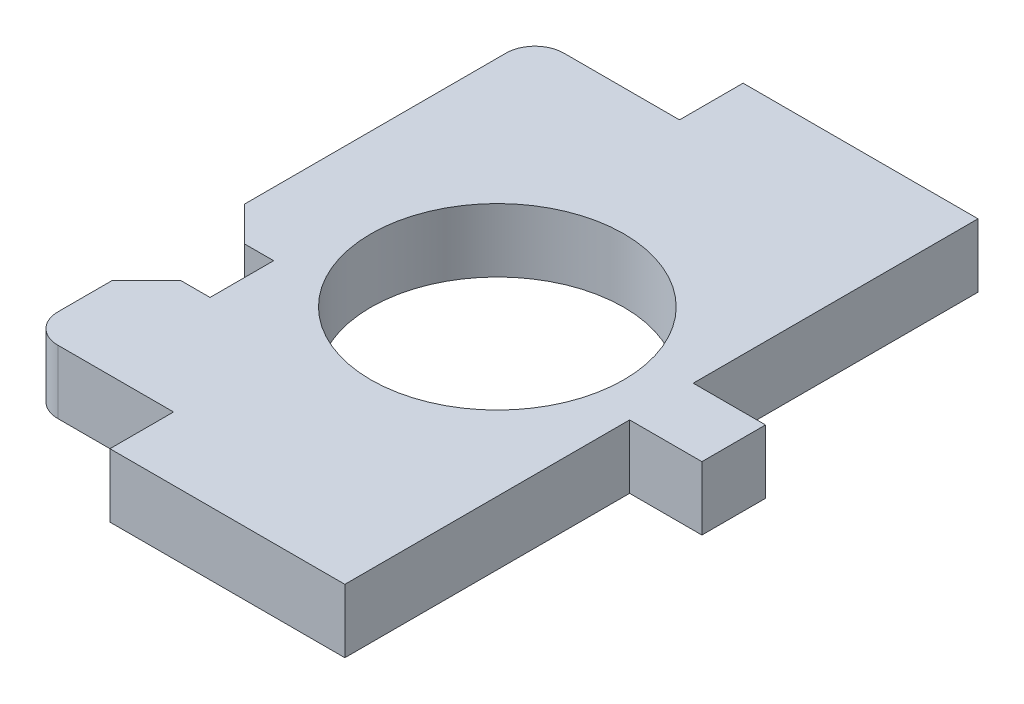
ISO-10303-21;
HEADER;
FILE_DESCRIPTION(('STEP AP214'),'2;1');
FILE_NAME('part.step','',(''),(''),'','','');
FILE_SCHEMA(('AUTOMOTIVE_DESIGN { 1 0 10303 214 1 1 1 1 }'));
ENDSEC;
DATA;
#1=APPLICATION_CONTEXT('core data for automotive mechanical design processes');
#2=APPLICATION_PROTOCOL_DEFINITION('international standard','automotive_design',2000,#1);
#3=PRODUCT_CONTEXT('',#1,'mechanical');
#4=PRODUCT('Part','Part','',(#3));
#5=PRODUCT_RELATED_PRODUCT_CATEGORY('part','',(#4));
#6=PRODUCT_DEFINITION_FORMATION('','',#4);
#7=PRODUCT_DEFINITION_CONTEXT('part definition',#1,'design');
#8=PRODUCT_DEFINITION('design','',#6,#7);
#9=PRODUCT_DEFINITION_SHAPE('','',#8);
#10=(LENGTH_UNIT() NAMED_UNIT(*) SI_UNIT(.MILLI.,.METRE.));
#11=(NAMED_UNIT(*) PLANE_ANGLE_UNIT() SI_UNIT($,.RADIAN.));
#12=(NAMED_UNIT(*) SI_UNIT($,.STERADIAN.) SOLID_ANGLE_UNIT());
#13=UNCERTAINTY_MEASURE_WITH_UNIT(LENGTH_MEASURE(1.E-05),#10,'distance_accuracy_value','');
#14=(GEOMETRIC_REPRESENTATION_CONTEXT(3) GLOBAL_UNCERTAINTY_ASSIGNED_CONTEXT((#13)) GLOBAL_UNIT_ASSIGNED_CONTEXT((#10,
#11,#12)) REPRESENTATION_CONTEXT('',''));
#15=CARTESIAN_POINT('',(0.,0.,0.));
#16=DIRECTION('',(0.,0.,1.));
#17=DIRECTION('',(1.,0.,0.));
#18=AXIS2_PLACEMENT_3D('',#15,#16,#17);
#19=CARTESIAN_POINT('',(13.81125,2.794,22.225));
#20=DIRECTION('',(-1.,0.,0.));
#21=DIRECTION('',(0.,0.,1.));
#22=AXIS2_PLACEMENT_3D('',#19,#20,#21);
#23=PLANE('',#22);
#24=DIRECTION('',(0.,-1.,0.));
#25=VECTOR('',#24,1.);
#26=CARTESIAN_POINT('',(13.81125,2.794,2.79399999999999));
#27=LINE('',#26,#25);
#28=CARTESIAN_POINT('',(13.81125,2.794,2.79399999999999));
#29=VERTEX_POINT('',#28);
#30=CARTESIAN_POINT('',(13.81125,-2.794,2.79399999999999));
#31=VERTEX_POINT('',#30);
#32=EDGE_CURVE('E173',#29,#31,#27,.T.);
#33=ORIENTED_EDGE('',*,*,#32,.F.);
#34=DIRECTION('',(0.,0.,-1.));
#35=VECTOR('',#34,1.);
#36=CARTESIAN_POINT('',(13.81125,2.794,-22.225));
#37=LINE('',#36,#35);
#38=CARTESIAN_POINT('',(13.81125,2.794,27.813));
#39=VERTEX_POINT('',#38);
#40=EDGE_CURVE('E184',#39,#29,#37,.T.);
#41=ORIENTED_EDGE('',*,*,#40,.F.);
#42=DIRECTION('',(0.,-1.,0.));
#43=VECTOR('',#42,1.);
#44=CARTESIAN_POINT('',(13.81125,2.794,27.813));
#45=LINE('',#44,#43);
#46=CARTESIAN_POINT('',(13.81125,-2.794,27.813));
#47=VERTEX_POINT('',#46);
#48=EDGE_CURVE('E234',#39,#47,#45,.T.);
#49=ORIENTED_EDGE('',*,*,#48,.T.);
#50=DIRECTION('',(0.,0.,-1.));
#51=VECTOR('',#50,1.);
#52=CARTESIAN_POINT('',(13.81125,-2.794,22.225));
#53=LINE('',#52,#51);
#54=EDGE_CURVE('E186',#47,#31,#53,.T.);
#55=ORIENTED_EDGE('',*,*,#54,.T.);
#56=EDGE_LOOP('',(#33,#41,#49,#55));
#57=FACE_BOUND('',#56,.T.);
#58=ADVANCED_FACE('F33',(#57),#23,.F.);
#59=CARTESIAN_POINT('',(-6.82625,2.794,-27.813));
#60=DIRECTION('',(0.,0.,1.));
#61=DIRECTION('',(1.,0.,0.));
#62=AXIS2_PLACEMENT_3D('',#59,#60,#61);
#63=PLANE('',#62);
#64=DIRECTION('',(-1.,0.,0.));
#65=VECTOR('',#64,1.);
#66=CARTESIAN_POINT('',(-6.82625,-2.794,-27.813));
#67=LINE('',#66,#65);
#68=CARTESIAN_POINT('',(13.81125,-2.794,-27.813));
#69=VERTEX_POINT('',#68);
#70=CARTESIAN_POINT('',(-6.82625,-2.794,-27.813));
#71=VERTEX_POINT('',#70);
#72=EDGE_CURVE('E187',#69,#71,#67,.T.);
#73=ORIENTED_EDGE('',*,*,#72,.T.);
#74=DIRECTION('',(0.,-1.,0.));
#75=VECTOR('',#74,1.);
#76=CARTESIAN_POINT('',(-6.82625,2.794,-27.813));
#77=LINE('',#76,#75);
#78=CARTESIAN_POINT('',(-6.82625,2.794,-27.813));
#79=VERTEX_POINT('',#78);
#80=EDGE_CURVE('E271',#79,#71,#77,.T.);
#81=ORIENTED_EDGE('',*,*,#80,.F.);
#82=DIRECTION('',(-1.,0.,0.));
#83=VECTOR('',#82,1.);
#84=CARTESIAN_POINT('',(-6.82625,2.794,-27.813));
#85=LINE('',#84,#83);
#86=CARTESIAN_POINT('',(13.81125,2.794,-27.813));
#87=VERTEX_POINT('',#86);
#88=EDGE_CURVE('E194',#87,#79,#85,.T.);
#89=ORIENTED_EDGE('',*,*,#88,.F.);
#90=DIRECTION('',(0.,-1.,0.));
#91=VECTOR('',#90,1.);
#92=CARTESIAN_POINT('',(13.81125,2.794,-27.813));
#93=LINE('',#92,#91);
#94=EDGE_CURVE('E267',#87,#69,#93,.T.);
#95=ORIENTED_EDGE('',*,*,#94,.T.);
#96=EDGE_LOOP('',(#73,#81,#89,#95));
#97=FACE_BOUND('',#96,.T.);
#98=ADVANCED_FACE('F350',(#97),#63,.F.);
#99=CARTESIAN_POINT('',(-6.82625,2.794,-22.225));
#100=DIRECTION('',(1.,0.,0.));
#101=DIRECTION('',(0.,0.,-1.));
#102=AXIS2_PLACEMENT_3D('',#99,#100,#101);
#103=PLANE('',#102);
#104=DIRECTION('',(0.,0.,1.));
#105=VECTOR('',#104,1.);
#106=CARTESIAN_POINT('',(-6.82625,-2.794,-22.225));
#107=LINE('',#106,#105);
#108=CARTESIAN_POINT('',(-6.82625,-2.794,-22.225));
#109=VERTEX_POINT('',#108);
#110=EDGE_CURVE('E236',#71,#109,#107,.T.);
#111=ORIENTED_EDGE('',*,*,#110,.T.);
#112=DIRECTION('',(0.,-1.,0.));
#113=VECTOR('',#112,1.);
#114=CARTESIAN_POINT('',(-6.82625,2.794,-22.225));
#115=LINE('',#114,#113);
#116=CARTESIAN_POINT('',(-6.82625,2.794,-22.225));
#117=VERTEX_POINT('',#116);
#118=EDGE_CURVE('E274',#117,#109,#115,.T.);
#119=ORIENTED_EDGE('',*,*,#118,.F.);
#120=DIRECTION('',(0.,0.,1.));
#121=VECTOR('',#120,1.);
#122=CARTESIAN_POINT('',(-6.82625,2.794,-22.225));
#123=LINE('',#122,#121);
#124=EDGE_CURVE('E197',#79,#117,#123,.T.);
#125=ORIENTED_EDGE('',*,*,#124,.F.);
#126=ORIENTED_EDGE('',*,*,#80,.T.);
#127=EDGE_LOOP('',(#111,#119,#125,#126));
#128=FACE_BOUND('',#127,.T.);
#129=ADVANCED_FACE('F356',(#128),#103,.F.);
#130=CARTESIAN_POINT('',(-13.81125,2.794,-22.225));
#131=DIRECTION('',(0.,0.,1.));
#132=DIRECTION('',(1.,0.,0.));
#133=AXIS2_PLACEMENT_3D('',#130,#131,#132);
#134=PLANE('',#133);
#135=DIRECTION('',(-1.,0.,0.));
#136=VECTOR('',#135,1.);
#137=CARTESIAN_POINT('',(-13.81125,-2.794,-22.225));
#138=LINE('',#137,#136);
#139=CARTESIAN_POINT('',(-16.98625,-2.794,-22.225));
#140=VERTEX_POINT('',#139);
#141=EDGE_CURVE('E239',#109,#140,#138,.T.);
#142=ORIENTED_EDGE('',*,*,#141,.T.);
#143=DIRECTION('',(0.,-1.,0.));
#144=VECTOR('',#143,1.);
#145=CARTESIAN_POINT('',(-16.98625,2.794,-22.225));
#146=LINE('',#145,#144);
#147=CARTESIAN_POINT('',(-16.98625,2.794,-22.225));
#148=VERTEX_POINT('',#147);
#149=EDGE_CURVE('E328',#140,#148,#146,.F.);
#150=ORIENTED_EDGE('',*,*,#149,.T.);
#151=DIRECTION('',(-1.,0.,0.));
#152=VECTOR('',#151,1.);
#153=CARTESIAN_POINT('',(-13.81125,2.794,-22.225));
#154=LINE('',#153,#152);
#155=EDGE_CURVE('E213',#117,#148,#154,.T.);
#156=ORIENTED_EDGE('',*,*,#155,.F.);
#157=ORIENTED_EDGE('',*,*,#118,.T.);
#158=EDGE_LOOP('',(#142,#150,#156,#157));
#159=FACE_BOUND('',#158,.T.);
#160=ADVANCED_FACE('F435',(#159),#134,.F.);
#161=CARTESIAN_POINT('',(-19.52625,2.794,-22.225));
#162=DIRECTION('',(1.,0.,0.));
#163=DIRECTION('',(0.,0.,-1.));
#164=AXIS2_PLACEMENT_3D('',#161,#162,#163);
#165=PLANE('',#164);
#166=DIRECTION('',(0.,0.,1.));
#167=VECTOR('',#166,1.);
#168=CARTESIAN_POINT('',(-19.52625,2.794,-22.225));
#169=LINE('',#168,#167);
#170=CARTESIAN_POINT('',(-19.52625,2.794,-19.685));
#171=VERTEX_POINT('',#170);
#172=CARTESIAN_POINT('',(-19.52625,2.794,3.27025000000001));
#173=VERTEX_POINT('',#172);
#174=EDGE_CURVE('E215',#171,#173,#169,.T.);
#175=ORIENTED_EDGE('',*,*,#174,.F.);
#176=DIRECTION('',(0.,-1.,0.));
#177=VECTOR('',#176,1.);
#178=CARTESIAN_POINT('',(-19.52625,2.794,-19.685));
#179=LINE('',#178,#177);
#180=CARTESIAN_POINT('',(-19.52625,-2.794,-19.685));
#181=VERTEX_POINT('',#180);
#182=EDGE_CURVE('E270',#171,#181,#179,.T.);
#183=ORIENTED_EDGE('',*,*,#182,.T.);
#184=DIRECTION('',(0.,0.,1.));
#185=VECTOR('',#184,1.);
#186=CARTESIAN_POINT('',(-19.52625,-2.794,-22.225));
#187=LINE('',#186,#185);
#188=CARTESIAN_POINT('',(-19.52625,-2.794,3.27025000000001));
#189=VERTEX_POINT('',#188);
#190=EDGE_CURVE('E242',#181,#189,#187,.T.);
#191=ORIENTED_EDGE('',*,*,#190,.T.);
#192=DIRECTION('',(0.,-1.,0.));
#193=VECTOR('',#192,1.);
#194=CARTESIAN_POINT('',(-19.52625,2.794,3.27025000000001));
#195=LINE('',#194,#193);
#196=EDGE_CURVE('E277',#173,#189,#195,.T.);
#197=ORIENTED_EDGE('',*,*,#196,.F.);
#198=EDGE_LOOP('',(#175,#183,#191,#197));
#199=FACE_BOUND('',#198,.T.);
#200=ADVANCED_FACE('F392',(#199),#165,.F.);
#201=CARTESIAN_POINT('',(-19.52625,2.794,3.27025000000001));
#202=DIRECTION('',(0.707106781186546,0.,-0.707106781186549));
#203=DIRECTION('',(-0.707106781186549,0.,-0.707106781186546));
#204=AXIS2_PLACEMENT_3D('',#201,#202,#203);
#205=PLANE('',#204);
#206=DIRECTION('',(0.707106781186549,0.,0.707106781186546));
#207=VECTOR('',#206,1.);
#208=CARTESIAN_POINT('',(-19.52625,-2.794,3.27025000000001));
#209=LINE('',#208,#207);
#210=CARTESIAN_POINT('',(-16.47825,-2.794,6.31825));
#211=VERTEX_POINT('',#210);
#212=EDGE_CURVE('E244',#189,#211,#209,.T.);
#213=ORIENTED_EDGE('',*,*,#212,.T.);
#214=DIRECTION('',(0.,-1.,0.));
#215=VECTOR('',#214,1.);
#216=CARTESIAN_POINT('',(-16.47825,2.794,6.31825));
#217=LINE('',#216,#215);
#218=CARTESIAN_POINT('',(-16.47825,2.794,6.31825));
#219=VERTEX_POINT('',#218);
#220=EDGE_CURVE('E280',#219,#211,#217,.T.);
#221=ORIENTED_EDGE('',*,*,#220,.F.);
#222=DIRECTION('',(0.707106781186549,0.,0.707106781186546));
#223=VECTOR('',#222,1.);
#224=CARTESIAN_POINT('',(-19.52625,2.794,3.27025000000001));
#225=LINE('',#224,#223);
#226=EDGE_CURVE('E217',#173,#219,#225,.T.);
#227=ORIENTED_EDGE('',*,*,#226,.F.);
#228=ORIENTED_EDGE('',*,*,#196,.T.);
#229=EDGE_LOOP('',(#213,#221,#227,#228));
#230=FACE_BOUND('',#229,.T.);
#231=ADVANCED_FACE('F399',(#230),#205,.F.);
#232=CARTESIAN_POINT('',(-16.47825,2.794,6.31825));
#233=DIRECTION('',(0.,0.,-1.));
#234=DIRECTION('',(-1.,0.,0.));
#235=AXIS2_PLACEMENT_3D('',#232,#233,#234);
#236=PLANE('',#235);
#237=DIRECTION('',(1.,0.,0.));
#238=VECTOR('',#237,1.);
#239=CARTESIAN_POINT('',(-16.47825,-2.794,6.31825));
#240=LINE('',#239,#238);
#241=CARTESIAN_POINT('',(-13.93825,-2.794,6.31824999999999));
#242=VERTEX_POINT('',#241);
#243=EDGE_CURVE('E246',#211,#242,#240,.T.);
#244=ORIENTED_EDGE('',*,*,#243,.T.);
#245=DIRECTION('',(0.,-1.,0.));
#246=VECTOR('',#245,1.);
#247=CARTESIAN_POINT('',(-13.93825,2.794,6.31824999999999));
#248=LINE('',#247,#246);
#249=CARTESIAN_POINT('',(-13.93825,2.794,6.31824999999999));
#250=VERTEX_POINT('',#249);
#251=EDGE_CURVE('E283',#250,#242,#248,.T.);
#252=ORIENTED_EDGE('',*,*,#251,.F.);
#253=DIRECTION('',(1.,0.,0.));
#254=VECTOR('',#253,1.);
#255=CARTESIAN_POINT('',(-16.47825,2.794,6.31825));
#256=LINE('',#255,#254);
#257=EDGE_CURVE('E219',#219,#250,#256,.T.);
#258=ORIENTED_EDGE('',*,*,#257,.F.);
#259=ORIENTED_EDGE('',*,*,#220,.T.);
#260=EDGE_LOOP('',(#244,#252,#258,#259));
#261=FACE_BOUND('',#260,.T.);
#262=ADVANCED_FACE('F403',(#261),#236,.F.);
#263=CARTESIAN_POINT('',(-13.93825,2.794,6.31824999999999));
#264=DIRECTION('',(1.,0.,0.));
#265=DIRECTION('',(0.,0.,-1.));
#266=AXIS2_PLACEMENT_3D('',#263,#264,#265);
#267=PLANE('',#266);
#268=DIRECTION('',(0.,0.,1.));
#269=VECTOR('',#268,1.);
#270=CARTESIAN_POINT('',(-13.93825,-2.794,6.31824999999999));
#271=LINE('',#270,#269);
#272=CARTESIAN_POINT('',(-13.93825,-2.794,11.90625));
#273=VERTEX_POINT('',#272);
#274=EDGE_CURVE('E248',#242,#273,#271,.T.);
#275=ORIENTED_EDGE('',*,*,#274,.T.);
#276=DIRECTION('',(0.,-1.,0.));
#277=VECTOR('',#276,1.);
#278=CARTESIAN_POINT('',(-13.93825,2.794,11.90625));
#279=LINE('',#278,#277);
#280=CARTESIAN_POINT('',(-13.93825,2.794,11.90625));
#281=VERTEX_POINT('',#280);
#282=EDGE_CURVE('E286',#281,#273,#279,.T.);
#283=ORIENTED_EDGE('',*,*,#282,.F.);
#284=DIRECTION('',(0.,0.,1.));
#285=VECTOR('',#284,1.);
#286=CARTESIAN_POINT('',(-13.93825,2.794,6.31824999999999));
#287=LINE('',#286,#285);
#288=EDGE_CURVE('E221',#250,#281,#287,.T.);
#289=ORIENTED_EDGE('',*,*,#288,.F.);
#290=ORIENTED_EDGE('',*,*,#251,.T.);
#291=EDGE_LOOP('',(#275,#283,#289,#290));
#292=FACE_BOUND('',#291,.T.);
#293=ADVANCED_FACE('F410',(#292),#267,.F.);
#294=CARTESIAN_POINT('',(-13.93825,2.794,11.90625));
#295=DIRECTION('',(0.,0.,1.));
#296=DIRECTION('',(1.,0.,0.));
#297=AXIS2_PLACEMENT_3D('',#294,#295,#296);
#298=PLANE('',#297);
#299=DIRECTION('',(-1.,0.,0.));
#300=VECTOR('',#299,1.);
#301=CARTESIAN_POINT('',(-13.93825,-2.794,11.90625));
#302=LINE('',#301,#300);
#303=CARTESIAN_POINT('',(-16.47825,-2.794,11.90625));
#304=VERTEX_POINT('',#303);
#305=EDGE_CURVE('E250',#273,#304,#302,.T.);
#306=ORIENTED_EDGE('',*,*,#305,.T.);
#307=DIRECTION('',(0.,-1.,0.));
#308=VECTOR('',#307,1.);
#309=CARTESIAN_POINT('',(-16.47825,2.794,11.90625));
#310=LINE('',#309,#308);
#311=CARTESIAN_POINT('',(-16.47825,2.794,11.90625));
#312=VERTEX_POINT('',#311);
#313=EDGE_CURVE('E289',#312,#304,#310,.T.);
#314=ORIENTED_EDGE('',*,*,#313,.F.);
#315=DIRECTION('',(-1.,0.,0.));
#316=VECTOR('',#315,1.);
#317=CARTESIAN_POINT('',(-13.93825,2.794,11.90625));
#318=LINE('',#317,#316);
#319=EDGE_CURVE('E223',#281,#312,#318,.T.);
#320=ORIENTED_EDGE('',*,*,#319,.F.);
#321=ORIENTED_EDGE('',*,*,#282,.T.);
#322=EDGE_LOOP('',(#306,#314,#320,#321));
#323=FACE_BOUND('',#322,.T.);
#324=ADVANCED_FACE('F413',(#323),#298,.F.);
#325=CARTESIAN_POINT('',(-16.47825,2.794,11.90625));
#326=DIRECTION('',(0.707106781186546,0.,0.707106781186549));
#327=DIRECTION('',(0.707106781186549,0.,-0.707106781186546));
#328=AXIS2_PLACEMENT_3D('',#325,#326,#327);
#329=PLANE('',#328);
#330=DIRECTION('',(-0.707106781186549,0.,0.707106781186546));
#331=VECTOR('',#330,1.);
#332=CARTESIAN_POINT('',(-16.47825,-2.794,11.90625));
#333=LINE('',#332,#331);
#334=CARTESIAN_POINT('',(-19.52625,-2.794,14.95425));
#335=VERTEX_POINT('',#334);
#336=EDGE_CURVE('E252',#304,#335,#333,.T.);
#337=ORIENTED_EDGE('',*,*,#336,.T.);
#338=DIRECTION('',(0.,-1.,0.));
#339=VECTOR('',#338,1.);
#340=CARTESIAN_POINT('',(-19.52625,2.794,14.95425));
#341=LINE('',#340,#339);
#342=CARTESIAN_POINT('',(-19.52625,2.794,14.95425));
#343=VERTEX_POINT('',#342);
#344=EDGE_CURVE('E292',#343,#335,#341,.T.);
#345=ORIENTED_EDGE('',*,*,#344,.F.);
#346=DIRECTION('',(-0.707106781186549,0.,0.707106781186546));
#347=VECTOR('',#346,1.);
#348=CARTESIAN_POINT('',(-16.47825,2.794,11.90625));
#349=LINE('',#348,#347);
#350=EDGE_CURVE('E225',#312,#343,#349,.T.);
#351=ORIENTED_EDGE('',*,*,#350,.F.);
#352=ORIENTED_EDGE('',*,*,#313,.T.);
#353=EDGE_LOOP('',(#337,#345,#351,#352));
#354=FACE_BOUND('',#353,.T.);
#355=ADVANCED_FACE('F416',(#354),#329,.F.);
#356=CARTESIAN_POINT('',(-19.52625,2.794,14.95425));
#357=DIRECTION('',(1.,0.,0.));
#358=DIRECTION('',(0.,0.,-1.));
#359=AXIS2_PLACEMENT_3D('',#356,#357,#358);
#360=PLANE('',#359);
#361=DIRECTION('',(0.,0.,1.));
#362=VECTOR('',#361,1.);
#363=CARTESIAN_POINT('',(-19.52625,-2.794,14.95425));
#364=LINE('',#363,#362);
#365=CARTESIAN_POINT('',(-19.52625,-2.794,19.685));
#366=VERTEX_POINT('',#365);
#367=EDGE_CURVE('E254',#335,#366,#364,.T.);
#368=ORIENTED_EDGE('',*,*,#367,.T.);
#369=DIRECTION('',(0.,-1.,0.));
#370=VECTOR('',#369,1.);
#371=CARTESIAN_POINT('',(-19.52625,2.794,19.685));
#372=LINE('',#371,#370);
#373=CARTESIAN_POINT('',(-19.52625,2.794,19.685));
#374=VERTEX_POINT('',#373);
#375=EDGE_CURVE('E11',#366,#374,#372,.F.);
#376=ORIENTED_EDGE('',*,*,#375,.T.);
#377=DIRECTION('',(0.,0.,1.));
#378=VECTOR('',#377,1.);
#379=CARTESIAN_POINT('',(-19.52625,2.794,14.95425));
#380=LINE('',#379,#378);
#381=EDGE_CURVE('E227',#343,#374,#380,.T.);
#382=ORIENTED_EDGE('',*,*,#381,.F.);
#383=ORIENTED_EDGE('',*,*,#344,.T.);
#384=EDGE_LOOP('',(#368,#376,#382,#383));
#385=FACE_BOUND('',#384,.T.);
#386=ADVANCED_FACE('F340',(#385),#360,.F.);
#387=CARTESIAN_POINT('',(-13.81125,2.794,22.225));
#388=DIRECTION('',(0.,0.,-1.));
#389=DIRECTION('',(-1.,0.,0.));
#390=AXIS2_PLACEMENT_3D('',#387,#388,#389);
#391=PLANE('',#390);
#392=DIRECTION('',(1.,0.,0.));
#393=VECTOR('',#392,1.);
#394=CARTESIAN_POINT('',(-19.52625,2.794,22.225));
#395=LINE('',#394,#393);
#396=CARTESIAN_POINT('',(-16.98625,2.794,22.225));
#397=VERTEX_POINT('',#396);
#398=CARTESIAN_POINT('',(-6.82625,2.794,22.225));
#399=VERTEX_POINT('',#398);
#400=EDGE_CURVE('E229',#397,#399,#395,.T.);
#401=ORIENTED_EDGE('',*,*,#400,.F.);
#402=DIRECTION('',(0.,-1.,0.));
#403=VECTOR('',#402,1.);
#404=CARTESIAN_POINT('',(-16.98625,2.794,22.225));
#405=LINE('',#404,#403);
#406=CARTESIAN_POINT('',(-16.98625,-2.794,22.225));
#407=VERTEX_POINT('',#406);
#408=EDGE_CURVE('E41',#397,#407,#405,.T.);
#409=ORIENTED_EDGE('',*,*,#408,.T.);
#410=DIRECTION('',(1.,0.,0.));
#411=VECTOR('',#410,1.);
#412=CARTESIAN_POINT('',(-13.81125,-2.794,22.225));
#413=LINE('',#412,#411);
#414=CARTESIAN_POINT('',(-6.82625,-2.794,22.225));
#415=VERTEX_POINT('',#414);
#416=EDGE_CURVE('E256',#407,#415,#413,.T.);
#417=ORIENTED_EDGE('',*,*,#416,.T.);
#418=DIRECTION('',(0.,-1.,0.));
#419=VECTOR('',#418,1.);
#420=CARTESIAN_POINT('',(-6.82625,2.794,22.225));
#421=LINE('',#420,#419);
#422=EDGE_CURVE('E295',#399,#415,#421,.T.);
#423=ORIENTED_EDGE('',*,*,#422,.F.);
#424=EDGE_LOOP('',(#401,#409,#417,#423));
#425=FACE_BOUND('',#424,.T.);
#426=ADVANCED_FACE('F335',(#425),#391,.F.);
#427=CARTESIAN_POINT('',(-6.82625,2.794,22.225));
#428=DIRECTION('',(1.,0.,0.));
#429=DIRECTION('',(0.,0.,-1.));
#430=AXIS2_PLACEMENT_3D('',#427,#428,#429);
#431=PLANE('',#430);
#432=DIRECTION('',(0.,0.,1.));
#433=VECTOR('',#432,1.);
#434=CARTESIAN_POINT('',(-6.82625,-2.794,22.225));
#435=LINE('',#434,#433);
#436=CARTESIAN_POINT('',(-6.82625,-2.794,27.813));
#437=VERTEX_POINT('',#436);
#438=EDGE_CURVE('E258',#415,#437,#435,.T.);
#439=ORIENTED_EDGE('',*,*,#438,.T.);
#440=DIRECTION('',(0.,-1.,0.));
#441=VECTOR('',#440,1.);
#442=CARTESIAN_POINT('',(-6.82625,2.794,27.813));
#443=LINE('',#442,#441);
#444=CARTESIAN_POINT('',(-6.82625,2.794,27.813));
#445=VERTEX_POINT('',#444);
#446=EDGE_CURVE('E297',#445,#437,#443,.T.);
#447=ORIENTED_EDGE('',*,*,#446,.F.);
#448=DIRECTION('',(0.,0.,1.));
#449=VECTOR('',#448,1.);
#450=CARTESIAN_POINT('',(-6.82625,2.794,22.225));
#451=LINE('',#450,#449);
#452=EDGE_CURVE('E231',#399,#445,#451,.T.);
#453=ORIENTED_EDGE('',*,*,#452,.F.);
#454=ORIENTED_EDGE('',*,*,#422,.T.);
#455=EDGE_LOOP('',(#439,#447,#453,#454));
#456=FACE_BOUND('',#455,.T.);
#457=ADVANCED_FACE('F369',(#456),#431,.F.);
#458=CARTESIAN_POINT('',(-6.82625,2.794,27.813));
#459=DIRECTION('',(0.,0.,-1.));
#460=DIRECTION('',(-1.,0.,0.));
#461=AXIS2_PLACEMENT_3D('',#458,#459,#460);
#462=PLANE('',#461);
#463=DIRECTION('',(1.,0.,0.));
#464=VECTOR('',#463,1.);
#465=CARTESIAN_POINT('',(-6.82625,-2.794,27.813));
#466=LINE('',#465,#464);
#467=EDGE_CURVE('E260',#437,#47,#466,.T.);
#468=ORIENTED_EDGE('',*,*,#467,.T.);
#469=ORIENTED_EDGE('',*,*,#48,.F.);
#470=DIRECTION('',(1.,0.,0.));
#471=VECTOR('',#470,1.);
#472=CARTESIAN_POINT('',(-6.82625,2.794,27.813));
#473=LINE('',#472,#471);
#474=EDGE_CURVE('E192',#445,#39,#473,.T.);
#475=ORIENTED_EDGE('',*,*,#474,.F.);
#476=ORIENTED_EDGE('',*,*,#446,.T.);
#477=EDGE_LOOP('',(#468,#469,#475,#476));
#478=FACE_BOUND('',#477,.T.);
#479=ADVANCED_FACE('F302',(#478),#462,.F.);
#480=CARTESIAN_POINT('',(13.81125,2.794,-2.79399999999999));
#481=VERTEX_POINT('',#480);
#482=EDGE_CURVE('E195',#481,#87,#37,.T.);
#483=ORIENTED_EDGE('',*,*,#482,.F.);
#484=DIRECTION('',(0.,-1.,0.));
#485=VECTOR('',#484,1.);
#486=CARTESIAN_POINT('',(13.81125,2.794,-2.79399999999999));
#487=LINE('',#486,#485);
#488=CARTESIAN_POINT('',(13.81125,-2.794,-2.79399999999999));
#489=VERTEX_POINT('',#488);
#490=EDGE_CURVE('E374',#481,#489,#487,.T.);
#491=ORIENTED_EDGE('',*,*,#490,.T.);
#492=EDGE_CURVE('E202',#489,#69,#53,.T.);
#493=ORIENTED_EDGE('',*,*,#492,.T.);
#494=ORIENTED_EDGE('',*,*,#94,.F.);
#495=EDGE_LOOP('',(#483,#491,#493,#494));
#496=FACE_BOUND('',#495,.T.);
#497=ADVANCED_FACE('F352',(#496),#23,.F.);
#498=CARTESIAN_POINT('',(0.,2.794,0.));
#499=DIRECTION('',(0.,-1.,0.));
#500=DIRECTION('',(0.,0.,-1.));
#501=AXIS2_PLACEMENT_3D('',#498,#499,#500);
#502=PLANE('',#501);
#503=CARTESIAN_POINT('',(-0.604747552220675,2.794,0.));
#504=DIRECTION('',(0.,1.,0.));
#505=DIRECTION('',(0.,0.,1.));
#506=AXIS2_PLACEMENT_3D('',#503,#504,#505);
#507=CIRCLE('',#506,11.1125);
#508=CARTESIAN_POINT('',(-0.604747552220675,2.794,11.1125));
#509=VERTEX_POINT('',#508);
#510=EDGE_CURVE('E316',#509,#509,#507,.T.);
#511=ORIENTED_EDGE('',*,*,#510,.F.);
#512=EDGE_LOOP('',(#511));
#513=FACE_BOUND('',#512,.T.);
#514=ORIENTED_EDGE('',*,*,#155,.T.);
#515=CARTESIAN_POINT('',(-16.98625,2.794,-19.685));
#516=DIRECTION('',(0.,-1.,0.));
#517=DIRECTION('',(0.,0.,-1.));
#518=AXIS2_PLACEMENT_3D('',#515,#516,#517);
#519=CIRCLE('',#518,2.54);
#520=EDGE_CURVE('E331',#148,#171,#519,.F.);
#521=ORIENTED_EDGE('',*,*,#520,.T.);
#522=ORIENTED_EDGE('',*,*,#174,.T.);
#523=ORIENTED_EDGE('',*,*,#226,.T.);
#524=ORIENTED_EDGE('',*,*,#257,.T.);
#525=ORIENTED_EDGE('',*,*,#288,.T.);
#526=ORIENTED_EDGE('',*,*,#319,.T.);
#527=ORIENTED_EDGE('',*,*,#350,.T.);
#528=ORIENTED_EDGE('',*,*,#381,.T.);
#529=CARTESIAN_POINT('',(-16.98625,2.794,19.685));
#530=DIRECTION('',(0.,-1.,0.));
#531=DIRECTION('',(0.,0.,-1.));
#532=AXIS2_PLACEMENT_3D('',#529,#530,#531);
#533=CIRCLE('',#532,2.54);
#534=EDGE_CURVE('E48',#374,#397,#533,.F.);
#535=ORIENTED_EDGE('',*,*,#534,.T.);
#536=ORIENTED_EDGE('',*,*,#400,.T.);
#537=ORIENTED_EDGE('',*,*,#452,.T.);
#538=ORIENTED_EDGE('',*,*,#474,.T.);
#539=ORIENTED_EDGE('',*,*,#40,.T.);
#540=DIRECTION('',(1.,0.,0.));
#541=VECTOR('',#540,1.);
#542=CARTESIAN_POINT('',(13.81125,2.794,2.79399999999999));
#543=LINE('',#542,#541);
#544=CARTESIAN_POINT('',(20.16125,2.794,2.79400000000001));
#545=VERTEX_POINT('',#544);
#546=EDGE_CURVE('E170',#29,#545,#543,.T.);
#547=ORIENTED_EDGE('',*,*,#546,.T.);
#548=DIRECTION('',(0.,0.,-1.));
#549=VECTOR('',#548,1.);
#550=CARTESIAN_POINT('',(20.16125,2.794,-2.79399999999999));
#551=LINE('',#550,#549);
#552=CARTESIAN_POINT('',(20.16125,2.794,-2.79399999999999));
#553=VERTEX_POINT('',#552);
#554=EDGE_CURVE('E179',#545,#553,#551,.T.);
#555=ORIENTED_EDGE('',*,*,#554,.T.);
#556=DIRECTION('',(-1.,0.,0.));
#557=VECTOR('',#556,1.);
#558=CARTESIAN_POINT('',(13.81125,2.794,-2.79399999999999));
#559=LINE('',#558,#557);
#560=EDGE_CURVE('E379',#553,#481,#559,.T.);
#561=ORIENTED_EDGE('',*,*,#560,.T.);
#562=ORIENTED_EDGE('',*,*,#482,.T.);
#563=ORIENTED_EDGE('',*,*,#88,.T.);
#564=ORIENTED_EDGE('',*,*,#124,.T.);
#565=EDGE_LOOP('',(#514,#521,#522,#523,#524,#525,#526,#527,#528,#535,#536,#537,#538,#539,#547,
#555,#561,#562,#563,#564));
#566=FACE_BOUND('',#565,.T.);
#567=ADVANCED_FACE('F190',(#513,#566),#502,.F.);
#568=CARTESIAN_POINT('',(0.,-2.794,0.));
#569=DIRECTION('',(0.,-1.,0.));
#570=DIRECTION('',(0.,0.,-1.));
#571=AXIS2_PLACEMENT_3D('',#568,#569,#570);
#572=PLANE('',#571);
#573=CARTESIAN_POINT('',(-0.604747552220675,-2.794,0.));
#574=DIRECTION('',(0.,-1.,0.));
#575=DIRECTION('',(0.,0.,-1.));
#576=AXIS2_PLACEMENT_3D('',#573,#574,#575);
#577=CIRCLE('',#576,11.1125);
#578=CARTESIAN_POINT('',(-0.604747552220675,-2.794,-11.1125));
#579=VERTEX_POINT('',#578);
#580=EDGE_CURVE('E312',#579,#579,#577,.T.);
#581=ORIENTED_EDGE('',*,*,#580,.F.);
#582=EDGE_LOOP('',(#581));
#583=FACE_BOUND('',#582,.T.);
#584=ORIENTED_EDGE('',*,*,#190,.F.);
#585=CARTESIAN_POINT('',(-16.98625,-2.794,-19.685));
#586=DIRECTION('',(0.,-1.,0.));
#587=DIRECTION('',(0.,0.,-1.));
#588=AXIS2_PLACEMENT_3D('',#585,#586,#587);
#589=CIRCLE('',#588,2.54);
#590=EDGE_CURVE('E326',#181,#140,#589,.T.);
#591=ORIENTED_EDGE('',*,*,#590,.T.);
#592=ORIENTED_EDGE('',*,*,#141,.F.);
#593=ORIENTED_EDGE('',*,*,#110,.F.);
#594=ORIENTED_EDGE('',*,*,#72,.F.);
#595=ORIENTED_EDGE('',*,*,#492,.F.);
#596=DIRECTION('',(-1.,0.,0.));
#597=VECTOR('',#596,1.);
#598=CARTESIAN_POINT('',(13.81125,-2.794,-2.79399999999999));
#599=LINE('',#598,#597);
#600=CARTESIAN_POINT('',(20.16125,-2.794,-2.79399999999999));
#601=VERTEX_POINT('',#600);
#602=EDGE_CURVE('E180',#601,#489,#599,.T.);
#603=ORIENTED_EDGE('',*,*,#602,.F.);
#604=DIRECTION('',(0.,0.,-1.));
#605=VECTOR('',#604,1.);
#606=CARTESIAN_POINT('',(20.16125,-2.794,-2.79399999999999));
#607=LINE('',#606,#605);
#608=CARTESIAN_POINT('',(20.16125,-2.794,2.79400000000001));
#609=VERTEX_POINT('',#608);
#610=EDGE_CURVE('E311',#609,#601,#607,.T.);
#611=ORIENTED_EDGE('',*,*,#610,.F.);
#612=DIRECTION('',(1.,0.,0.));
#613=VECTOR('',#612,1.);
#614=CARTESIAN_POINT('',(13.81125,-2.794,2.79399999999999));
#615=LINE('',#614,#613);
#616=EDGE_CURVE('E309',#31,#609,#615,.T.);
#617=ORIENTED_EDGE('',*,*,#616,.F.);
#618=ORIENTED_EDGE('',*,*,#54,.F.);
#619=ORIENTED_EDGE('',*,*,#467,.F.);
#620=ORIENTED_EDGE('',*,*,#438,.F.);
#621=ORIENTED_EDGE('',*,*,#416,.F.);
#622=CARTESIAN_POINT('',(-16.98625,-2.794,19.685));
#623=DIRECTION('',(0.,-1.,0.));
#624=DIRECTION('',(0.,0.,-1.));
#625=AXIS2_PLACEMENT_3D('',#622,#623,#624);
#626=CIRCLE('',#625,2.54);
#627=EDGE_CURVE('E324',#407,#366,#626,.T.);
#628=ORIENTED_EDGE('',*,*,#627,.T.);
#629=ORIENTED_EDGE('',*,*,#367,.F.);
#630=ORIENTED_EDGE('',*,*,#336,.F.);
#631=ORIENTED_EDGE('',*,*,#305,.F.);
#632=ORIENTED_EDGE('',*,*,#274,.F.);
#633=ORIENTED_EDGE('',*,*,#243,.F.);
#634=ORIENTED_EDGE('',*,*,#212,.F.);
#635=EDGE_LOOP('',(#584,#591,#592,#593,#594,#595,#603,#611,#617,#618,#619,#620,#621,#628,#629,
#630,#631,#632,#633,#634));
#636=FACE_BOUND('',#635,.T.);
#637=ADVANCED_FACE('F306',(#583,#636),#572,.T.);
#638=CARTESIAN_POINT('',(13.81125,2.794,2.79399999999999));
#639=DIRECTION('',(0.,0.,-1.));
#640=DIRECTION('',(-1.,0.,0.));
#641=AXIS2_PLACEMENT_3D('',#638,#639,#640);
#642=PLANE('',#641);
#643=ORIENTED_EDGE('',*,*,#616,.T.);
#644=DIRECTION('',(0.,-1.,0.));
#645=VECTOR('',#644,1.);
#646=CARTESIAN_POINT('',(20.16125,2.794,2.79400000000001));
#647=LINE('',#646,#645);
#648=EDGE_CURVE('E176',#545,#609,#647,.T.);
#649=ORIENTED_EDGE('',*,*,#648,.F.);
#650=ORIENTED_EDGE('',*,*,#546,.F.);
#651=ORIENTED_EDGE('',*,*,#32,.T.);
#652=EDGE_LOOP('',(#643,#649,#650,#651));
#653=FACE_BOUND('',#652,.T.);
#654=ADVANCED_FACE('F172',(#653),#642,.F.);
#655=CARTESIAN_POINT('',(20.16125,2.794,-2.79399999999999));
#656=DIRECTION('',(-1.,0.,0.));
#657=DIRECTION('',(0.,0.,1.));
#658=AXIS2_PLACEMENT_3D('',#655,#656,#657);
#659=PLANE('',#658);
#660=ORIENTED_EDGE('',*,*,#610,.T.);
#661=DIRECTION('',(0.,-1.,0.));
#662=VECTOR('',#661,1.);
#663=CARTESIAN_POINT('',(20.16125,2.794,-2.79399999999999));
#664=LINE('',#663,#662);
#665=EDGE_CURVE('E598',#553,#601,#664,.T.);
#666=ORIENTED_EDGE('',*,*,#665,.F.);
#667=ORIENTED_EDGE('',*,*,#554,.F.);
#668=ORIENTED_EDGE('',*,*,#648,.T.);
#669=EDGE_LOOP('',(#660,#666,#667,#668));
#670=FACE_BOUND('',#669,.T.);
#671=ADVANCED_FACE('F513',(#670),#659,.F.);
#672=CARTESIAN_POINT('',(13.81125,2.794,-2.79399999999999));
#673=DIRECTION('',(0.,0.,1.));
#674=DIRECTION('',(1.,0.,0.));
#675=AXIS2_PLACEMENT_3D('',#672,#673,#674);
#676=PLANE('',#675);
#677=ORIENTED_EDGE('',*,*,#602,.T.);
#678=ORIENTED_EDGE('',*,*,#490,.F.);
#679=ORIENTED_EDGE('',*,*,#560,.F.);
#680=ORIENTED_EDGE('',*,*,#665,.T.);
#681=EDGE_LOOP('',(#677,#678,#679,#680));
#682=FACE_BOUND('',#681,.T.);
#683=ADVANCED_FACE('F524',(#682),#676,.F.);
#684=CARTESIAN_POINT('',(-0.604747552220675,-2.79405,0.));
#685=DIRECTION('',(0.,1.,0.));
#686=DIRECTION('',(0.,0.,1.));
#687=AXIS2_PLACEMENT_3D('',#684,#685,#686);
#688=CYLINDRICAL_SURFACE('',#687,11.1125);
#689=ORIENTED_EDGE('',*,*,#580,.T.);
#690=EDGE_LOOP('',(#689));
#691=FACE_BOUND('',#690,.T.);
#692=ORIENTED_EDGE('',*,*,#510,.T.);
#693=EDGE_LOOP('',(#692));
#694=FACE_BOUND('',#693,.T.);
#695=ADVANCED_FACE('F347',(#691,#694),#688,.F.);
#696=CARTESIAN_POINT('',(-16.98625,2.794,-19.685));
#697=DIRECTION('',(0.,-1.,0.));
#698=DIRECTION('',(0.,0.,-1.));
#699=AXIS2_PLACEMENT_3D('',#696,#697,#698);
#700=CYLINDRICAL_SURFACE('',#699,2.54);
#701=ORIENTED_EDGE('',*,*,#520,.F.);
#702=ORIENTED_EDGE('',*,*,#149,.F.);
#703=ORIENTED_EDGE('',*,*,#590,.F.);
#704=ORIENTED_EDGE('',*,*,#182,.F.);
#705=EDGE_LOOP('',(#701,#702,#703,#704));
#706=FACE_BOUND('',#705,.T.);
#707=ADVANCED_FACE('F343',(#706),#700,.T.);
#708=CARTESIAN_POINT('',(-16.98625,2.794,19.685));
#709=DIRECTION('',(0.,-1.,0.));
#710=DIRECTION('',(0.,0.,-1.));
#711=AXIS2_PLACEMENT_3D('',#708,#709,#710);
#712=CYLINDRICAL_SURFACE('',#711,2.54);
#713=ORIENTED_EDGE('',*,*,#534,.F.);
#714=ORIENTED_EDGE('',*,*,#375,.F.);
#715=ORIENTED_EDGE('',*,*,#627,.F.);
#716=ORIENTED_EDGE('',*,*,#408,.F.);
#717=EDGE_LOOP('',(#713,#714,#715,#716));
#718=FACE_BOUND('',#717,.T.);
#719=ADVANCED_FACE('F35',(#718),#712,.T.);
#720=CLOSED_SHELL('',(#58,#98,#129,#160,#200,#231,#262,#293,#324,#355,#386,#426,#457,#479,#497,
#567,#637,#654,#671,#683,#695,#707,#719));
#721=MANIFOLD_SOLID_BREP('B2',#720);
#722=ADVANCED_BREP_SHAPE_REPRESENTATION('',(#18,#721),#14);
#723=SHAPE_DEFINITION_REPRESENTATION(#9,#722);
ENDSEC;
END-ISO-10303-21;
